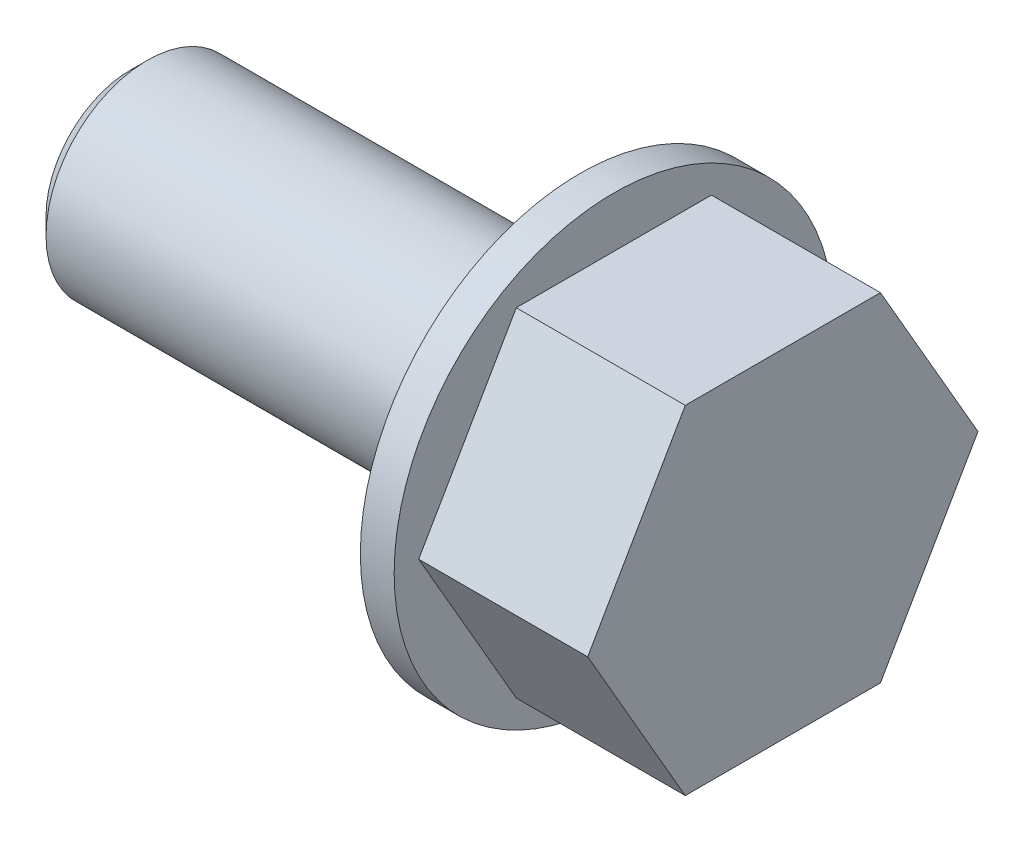
ISO-10303-21;
HEADER;
FILE_DESCRIPTION(('STEP AP214'),'2;1');
FILE_NAME('part.step','',(''),(''),'','','');
FILE_SCHEMA(('AUTOMOTIVE_DESIGN { 1 0 10303 214 1 1 1 1 }'));
ENDSEC;
DATA;
#1=APPLICATION_CONTEXT('core data for automotive mechanical design processes');
#2=APPLICATION_PROTOCOL_DEFINITION('international standard','automotive_design',2000,#1);
#3=PRODUCT_CONTEXT('',#1,'mechanical');
#4=PRODUCT('Part','Part','',(#3));
#5=PRODUCT_RELATED_PRODUCT_CATEGORY('part','',(#4));
#6=PRODUCT_DEFINITION_FORMATION('','',#4);
#7=PRODUCT_DEFINITION_CONTEXT('part definition',#1,'design');
#8=PRODUCT_DEFINITION('design','',#6,#7);
#9=PRODUCT_DEFINITION_SHAPE('','',#8);
#10=(LENGTH_UNIT() NAMED_UNIT(*) SI_UNIT(.MILLI.,.METRE.));
#11=(NAMED_UNIT(*) PLANE_ANGLE_UNIT() SI_UNIT($,.RADIAN.));
#12=(NAMED_UNIT(*) SI_UNIT($,.STERADIAN.) SOLID_ANGLE_UNIT());
#13=UNCERTAINTY_MEASURE_WITH_UNIT(LENGTH_MEASURE(1.E-05),#10,'distance_accuracy_value','');
#14=(GEOMETRIC_REPRESENTATION_CONTEXT(3) GLOBAL_UNCERTAINTY_ASSIGNED_CONTEXT((#13)) GLOBAL_UNIT_ASSIGNED_CONTEXT((#10,
#11,#12)) REPRESENTATION_CONTEXT('',''));
#15=CARTESIAN_POINT('',(0.,0.,0.));
#16=DIRECTION('',(0.,0.,1.));
#17=DIRECTION('',(1.,0.,0.));
#18=AXIS2_PLACEMENT_3D('',#15,#16,#17);
#19=CARTESIAN_POINT('',(168.319211312072,213.439611749176,57.3045490505835));
#20=DIRECTION('',(-1.,0.,0.));
#21=DIRECTION('',(0.,0.,1.));
#22=AXIS2_PLACEMENT_3D('',#19,#20,#21);
#23=PLANE('',#22);
#24=CARTESIAN_POINT('',(168.319211312072,213.439611749176,57.3045490505835));
#25=DIRECTION('',(-1.,0.,0.));
#26=DIRECTION('',(0.,0.,1.));
#27=AXIS2_PLACEMENT_3D('',#24,#25,#26);
#28=CIRCLE('',#27,2.5);
#29=CARTESIAN_POINT('',(168.319211312072,213.439611749176,59.8045490505835));
#30=VERTEX_POINT('',#29);
#31=EDGE_CURVE('E25',#30,#30,#28,.T.);
#32=ORIENTED_EDGE('',*,*,#31,.T.);
#33=EDGE_LOOP('',(#32));
#34=FACE_BOUND('',#33,.T.);
#35=ADVANCED_FACE('F17',(#34),#23,.T.);
#36=CARTESIAN_POINT('',(181.619211312073,213.439611749176,57.3045490505835));
#37=DIRECTION('',(-1.,0.,0.));
#38=DIRECTION('',(0.,0.,1.));
#39=AXIS2_PLACEMENT_3D('',#36,#37,#38);
#40=CYLINDRICAL_SURFACE('',#39,3.);
#41=CARTESIAN_POINT('',(168.819211312072,213.439611749176,57.3045490505835));
#42=DIRECTION('',(-1.,0.,0.));
#43=DIRECTION('',(0.,0.,1.));
#44=AXIS2_PLACEMENT_3D('',#41,#42,#43);
#45=CIRCLE('',#44,3.);
#46=CARTESIAN_POINT('',(168.819211312072,213.439611749176,60.3045490505835));
#47=VERTEX_POINT('',#46);
#48=EDGE_CURVE('E11',#47,#47,#45,.F.);
#49=ORIENTED_EDGE('',*,*,#48,.T.);
#50=EDGE_LOOP('',(#49));
#51=FACE_BOUND('',#50,.T.);
#52=CARTESIAN_POINT('',(181.619211312073,213.439611749176,57.3045490505835));
#53=DIRECTION('',(1.,0.,0.));
#54=DIRECTION('',(0.,0.,1.));
#55=AXIS2_PLACEMENT_3D('',#52,#53,#54);
#56=CIRCLE('',#55,3.);
#57=CARTESIAN_POINT('',(181.619211312073,213.439611749176,60.3045490505835));
#58=VERTEX_POINT('',#57);
#59=EDGE_CURVE('E95',#58,#58,#56,.T.);
#60=ORIENTED_EDGE('',*,*,#59,.F.);
#61=EDGE_LOOP('',(#60));
#62=FACE_BOUND('',#61,.T.);
#63=ADVANCED_FACE('F152',(#51,#62),#40,.T.);
#64=CARTESIAN_POINT('',(181.619211312073,218.439611749175,54.4177977046355));
#65=DIRECTION('',(-1.,0.,0.));
#66=DIRECTION('',(0.,0.,1.));
#67=AXIS2_PLACEMENT_3D('',#64,#65,#66);
#68=PLANE('',#67);
#69=ORIENTED_EDGE('',*,*,#59,.T.);
#70=EDGE_LOOP('',(#69));
#71=FACE_BOUND('',#70,.T.);
#72=CARTESIAN_POINT('',(181.619211312073,213.439611749175,57.3045490505835));
#73=DIRECTION('',(-1.,0.,0.));
#74=DIRECTION('',(0.,0.,1.));
#75=AXIS2_PLACEMENT_3D('',#72,#73,#74);
#76=CIRCLE('',#75,6.5);
#77=CARTESIAN_POINT('',(181.619211312073,213.439611749175,63.8045490505835));
#78=VERTEX_POINT('',#77);
#79=EDGE_CURVE('E131',#78,#78,#76,.T.);
#80=ORIENTED_EDGE('',*,*,#79,.T.);
#81=EDGE_LOOP('',(#80));
#82=FACE_BOUND('',#81,.T.);
#83=ADVANCED_FACE('F149',(#71,#82),#68,.T.);
#84=CARTESIAN_POINT('',(182.619211312073,213.439611749175,57.3045490505835));
#85=DIRECTION('',(-1.,0.,0.));
#86=DIRECTION('',(0.,0.,1.));
#87=AXIS2_PLACEMENT_3D('',#84,#85,#86);
#88=CYLINDRICAL_SURFACE('',#87,6.5);
#89=CARTESIAN_POINT('',(182.619211312073,213.439611749175,57.3045490505835));
#90=DIRECTION('',(-1.,0.,0.));
#91=DIRECTION('',(0.,0.,1.));
#92=AXIS2_PLACEMENT_3D('',#89,#90,#91);
#93=CIRCLE('',#92,6.5);
#94=CARTESIAN_POINT('',(182.619211312073,213.439611749175,63.8045490505835));
#95=VERTEX_POINT('',#94);
#96=EDGE_CURVE('E130',#95,#95,#93,.T.);
#97=ORIENTED_EDGE('',*,*,#96,.T.);
#98=EDGE_LOOP('',(#97));
#99=FACE_BOUND('',#98,.T.);
#100=ORIENTED_EDGE('',*,*,#79,.F.);
#101=EDGE_LOOP('',(#100));
#102=FACE_BOUND('',#101,.T.);
#103=ADVANCED_FACE('F137',(#99,#102),#88,.T.);
#104=CARTESIAN_POINT('',(182.619211312073,213.439611749175,57.3045490505835));
#105=DIRECTION('',(1.,0.,0.));
#106=DIRECTION('',(0.,0.,-1.));
#107=AXIS2_PLACEMENT_3D('',#104,#105,#106);
#108=PLANE('',#107);
#109=DIRECTION('',(0.,0.866025403784438,-0.5));
#110=VECTOR('',#109,1.);
#111=CARTESIAN_POINT('',(182.619211312073,208.439611749175,54.4177977046355));
#112=LINE('',#111,#110);
#113=CARTESIAN_POINT('',(182.619211312073,208.439611749175,54.4177977046355));
#114=VERTEX_POINT('',#113);
#115=CARTESIAN_POINT('',(182.619211312073,213.439611749175,51.5310463586873));
#116=VERTEX_POINT('',#115);
#117=EDGE_CURVE('E89',#114,#116,#112,.T.);
#118=ORIENTED_EDGE('',*,*,#117,.F.);
#119=DIRECTION('',(0.,0.,-1.));
#120=VECTOR('',#119,1.);
#121=CARTESIAN_POINT('',(182.619211312073,208.439611749175,60.1913003965317));
#122=LINE('',#121,#120);
#123=CARTESIAN_POINT('',(182.619211312073,208.439611749175,60.1913003965317));
#124=VERTEX_POINT('',#123);
#125=EDGE_CURVE('E128',#124,#114,#122,.T.);
#126=ORIENTED_EDGE('',*,*,#125,.F.);
#127=DIRECTION('',(0.,-0.866025403784439,-0.5));
#128=VECTOR('',#127,1.);
#129=CARTESIAN_POINT('',(182.619211312073,213.439611749175,63.0780517424798));
#130=LINE('',#129,#128);
#131=CARTESIAN_POINT('',(182.619211312073,213.439611749175,63.0780517424798));
#132=VERTEX_POINT('',#131);
#133=EDGE_CURVE('E125',#132,#124,#130,.T.);
#134=ORIENTED_EDGE('',*,*,#133,.F.);
#135=DIRECTION('',(0.,-0.866025403784437,0.5));
#136=VECTOR('',#135,1.);
#137=CARTESIAN_POINT('',(182.619211312073,218.439611749175,60.1913003965317));
#138=LINE('',#137,#136);
#139=CARTESIAN_POINT('',(182.619211312073,218.439611749175,60.1913003965317));
#140=VERTEX_POINT('',#139);
#141=EDGE_CURVE('E123',#140,#132,#138,.T.);
#142=ORIENTED_EDGE('',*,*,#141,.F.);
#143=DIRECTION('',(0.,0.,1.));
#144=VECTOR('',#143,1.);
#145=CARTESIAN_POINT('',(182.619211312073,218.439611749175,54.4177977046355));
#146=LINE('',#145,#144);
#147=CARTESIAN_POINT('',(182.619211312073,218.439611749175,54.4177977046355));
#148=VERTEX_POINT('',#147);
#149=EDGE_CURVE('E91',#148,#140,#146,.T.);
#150=ORIENTED_EDGE('',*,*,#149,.F.);
#151=DIRECTION('',(0.,0.86602540378444,0.5));
#152=VECTOR('',#151,1.);
#153=CARTESIAN_POINT('',(182.619211312073,213.439611749175,51.5310463586873));
#154=LINE('',#153,#152);
#155=EDGE_CURVE('E73',#116,#148,#154,.T.);
#156=ORIENTED_EDGE('',*,*,#155,.F.);
#157=EDGE_LOOP('',(#118,#126,#134,#142,#150,#156));
#158=FACE_BOUND('',#157,.T.);
#159=ORIENTED_EDGE('',*,*,#96,.F.);
#160=EDGE_LOOP('',(#159));
#161=FACE_BOUND('',#160,.T.);
#162=ADVANCED_FACE('F86',(#158,#161),#108,.T.);
#163=CARTESIAN_POINT('',(187.619211312073,218.439611749175,54.4177977046355));
#164=DIRECTION('',(-1.,0.,0.));
#165=DIRECTION('',(0.,0.,1.));
#166=AXIS2_PLACEMENT_3D('',#163,#164,#165);
#167=PLANE('',#166);
#168=DIRECTION('',(0.,0.86602540378444,0.5));
#169=VECTOR('',#168,1.);
#170=CARTESIAN_POINT('',(187.619211312073,213.439611749175,51.5310463586873));
#171=LINE('',#170,#169);
#172=CARTESIAN_POINT('',(187.619211312073,213.439611749175,51.5310463586873));
#173=VERTEX_POINT('',#172);
#174=CARTESIAN_POINT('',(187.619211312073,218.439611749175,54.4177977046355));
#175=VERTEX_POINT('',#174);
#176=EDGE_CURVE('E76',#173,#175,#171,.T.);
#177=ORIENTED_EDGE('',*,*,#176,.T.);
#178=DIRECTION('',(0.,0.,1.));
#179=VECTOR('',#178,1.);
#180=CARTESIAN_POINT('',(187.619211312073,218.439611749175,54.4177977046355));
#181=LINE('',#180,#179);
#182=CARTESIAN_POINT('',(187.619211312073,218.439611749175,60.1913003965317));
#183=VERTEX_POINT('',#182);
#184=EDGE_CURVE('E118',#175,#183,#181,.T.);
#185=ORIENTED_EDGE('',*,*,#184,.T.);
#186=DIRECTION('',(0.,-0.866025403784437,0.5));
#187=VECTOR('',#186,1.);
#188=CARTESIAN_POINT('',(187.619211312073,218.439611749175,60.1913003965317));
#189=LINE('',#188,#187);
#190=CARTESIAN_POINT('',(187.619211312073,213.439611749175,63.0780517424798));
#191=VERTEX_POINT('',#190);
#192=EDGE_CURVE('E115',#183,#191,#189,.T.);
#193=ORIENTED_EDGE('',*,*,#192,.T.);
#194=DIRECTION('',(0.,-0.866025403784439,-0.5));
#195=VECTOR('',#194,1.);
#196=CARTESIAN_POINT('',(187.619211312073,213.439611749175,63.0780517424798));
#197=LINE('',#196,#195);
#198=CARTESIAN_POINT('',(187.619211312073,208.439611749175,60.1913003965317));
#199=VERTEX_POINT('',#198);
#200=EDGE_CURVE('E112',#191,#199,#197,.T.);
#201=ORIENTED_EDGE('',*,*,#200,.T.);
#202=DIRECTION('',(0.,0.,-1.));
#203=VECTOR('',#202,1.);
#204=CARTESIAN_POINT('',(187.619211312073,208.439611749175,60.1913003965317));
#205=LINE('',#204,#203);
#206=CARTESIAN_POINT('',(187.619211312073,208.439611749175,54.4177977046355));
#207=VERTEX_POINT('',#206);
#208=EDGE_CURVE('E109',#199,#207,#205,.T.);
#209=ORIENTED_EDGE('',*,*,#208,.T.);
#210=DIRECTION('',(0.,0.866025403784438,-0.5));
#211=VECTOR('',#210,1.);
#212=CARTESIAN_POINT('',(187.619211312073,208.439611749175,54.4177977046355));
#213=LINE('',#212,#211);
#214=EDGE_CURVE('E82',#207,#173,#213,.T.);
#215=ORIENTED_EDGE('',*,*,#214,.T.);
#216=EDGE_LOOP('',(#177,#185,#193,#201,#209,#215));
#217=FACE_BOUND('',#216,.T.);
#218=ADVANCED_FACE('F140',(#217),#167,.F.);
#219=CARTESIAN_POINT('',(187.619211312073,208.439611749175,54.4177977046355));
#220=DIRECTION('',(0.,-0.5,-0.866025403784438));
#221=DIRECTION('',(0.,0.866025403784438,-0.5));
#222=AXIS2_PLACEMENT_3D('',#219,#220,#221);
#223=PLANE('',#222);
#224=ORIENTED_EDGE('',*,*,#117,.T.);
#225=DIRECTION('',(-1.,0.,0.));
#226=VECTOR('',#225,1.);
#227=CARTESIAN_POINT('',(187.619211312073,213.439611749175,51.5310463586873));
#228=LINE('',#227,#226);
#229=EDGE_CURVE('E70',#173,#116,#228,.T.);
#230=ORIENTED_EDGE('',*,*,#229,.F.);
#231=ORIENTED_EDGE('',*,*,#214,.F.);
#232=DIRECTION('',(-1.,0.,0.));
#233=VECTOR('',#232,1.);
#234=CARTESIAN_POINT('',(187.619211312073,208.439611749175,54.4177977046355));
#235=LINE('',#234,#233);
#236=EDGE_CURVE('E81',#207,#114,#235,.T.);
#237=ORIENTED_EDGE('',*,*,#236,.T.);
#238=EDGE_LOOP('',(#224,#230,#231,#237));
#239=FACE_BOUND('',#238,.T.);
#240=ADVANCED_FACE('F93',(#239),#223,.T.);
#241=CARTESIAN_POINT('',(187.619211312073,208.439611749175,60.1913003965317));
#242=DIRECTION('',(0.,-1.,0.));
#243=DIRECTION('',(0.,0.,-1.));
#244=AXIS2_PLACEMENT_3D('',#241,#242,#243);
#245=PLANE('',#244);
#246=ORIENTED_EDGE('',*,*,#125,.T.);
#247=ORIENTED_EDGE('',*,*,#236,.F.);
#248=ORIENTED_EDGE('',*,*,#208,.F.);
#249=DIRECTION('',(-1.,0.,0.));
#250=VECTOR('',#249,1.);
#251=CARTESIAN_POINT('',(187.619211312073,208.439611749175,60.1913003965317));
#252=LINE('',#251,#250);
#253=EDGE_CURVE('E105',#199,#124,#252,.T.);
#254=ORIENTED_EDGE('',*,*,#253,.T.);
#255=EDGE_LOOP('',(#246,#247,#248,#254));
#256=FACE_BOUND('',#255,.T.);
#257=ADVANCED_FACE('F171',(#256),#245,.T.);
#258=CARTESIAN_POINT('',(187.619211312073,213.439611749175,63.0780517424798));
#259=DIRECTION('',(0.,-0.5,0.866025403784439));
#260=DIRECTION('',(0.,-0.866025403784439,-0.5));
#261=AXIS2_PLACEMENT_3D('',#258,#259,#260);
#262=PLANE('',#261);
#263=ORIENTED_EDGE('',*,*,#133,.T.);
#264=ORIENTED_EDGE('',*,*,#253,.F.);
#265=ORIENTED_EDGE('',*,*,#200,.F.);
#266=DIRECTION('',(-1.,0.,0.));
#267=VECTOR('',#266,1.);
#268=CARTESIAN_POINT('',(187.619211312073,213.439611749175,63.0780517424798));
#269=LINE('',#268,#267);
#270=EDGE_CURVE('E103',#191,#132,#269,.T.);
#271=ORIENTED_EDGE('',*,*,#270,.T.);
#272=EDGE_LOOP('',(#263,#264,#265,#271));
#273=FACE_BOUND('',#272,.T.);
#274=ADVANCED_FACE('F168',(#273),#262,.T.);
#275=CARTESIAN_POINT('',(187.619211312073,218.439611749175,60.1913003965317));
#276=DIRECTION('',(0.,0.5,0.866025403784437));
#277=DIRECTION('',(0.,-0.866025403784437,0.5));
#278=AXIS2_PLACEMENT_3D('',#275,#276,#277);
#279=PLANE('',#278);
#280=ORIENTED_EDGE('',*,*,#141,.T.);
#281=ORIENTED_EDGE('',*,*,#270,.F.);
#282=ORIENTED_EDGE('',*,*,#192,.F.);
#283=DIRECTION('',(-1.,0.,0.));
#284=VECTOR('',#283,1.);
#285=CARTESIAN_POINT('',(187.619211312073,218.439611749175,60.1913003965317));
#286=LINE('',#285,#284);
#287=EDGE_CURVE('E40',#183,#140,#286,.T.);
#288=ORIENTED_EDGE('',*,*,#287,.T.);
#289=EDGE_LOOP('',(#280,#281,#282,#288));
#290=FACE_BOUND('',#289,.T.);
#291=ADVANCED_FACE('F165',(#290),#279,.T.);
#292=CARTESIAN_POINT('',(187.619211312073,218.439611749175,54.4177977046355));
#293=DIRECTION('',(0.,1.,0.));
#294=DIRECTION('',(0.,0.,1.));
#295=AXIS2_PLACEMENT_3D('',#292,#293,#294);
#296=PLANE('',#295);
#297=ORIENTED_EDGE('',*,*,#149,.T.);
#298=ORIENTED_EDGE('',*,*,#287,.F.);
#299=ORIENTED_EDGE('',*,*,#184,.F.);
#300=DIRECTION('',(-1.,0.,0.));
#301=VECTOR('',#300,1.);
#302=CARTESIAN_POINT('',(187.619211312073,218.439611749175,54.4177977046355));
#303=LINE('',#302,#301);
#304=EDGE_CURVE('E32',#175,#148,#303,.T.);
#305=ORIENTED_EDGE('',*,*,#304,.T.);
#306=EDGE_LOOP('',(#297,#298,#299,#305));
#307=FACE_BOUND('',#306,.T.);
#308=ADVANCED_FACE('F162',(#307),#296,.T.);
#309=CARTESIAN_POINT('',(187.619211312073,213.439611749175,51.5310463586873));
#310=DIRECTION('',(0.,0.5,-0.86602540378444));
#311=DIRECTION('',(0.,0.86602540378444,0.5));
#312=AXIS2_PLACEMENT_3D('',#309,#310,#311);
#313=PLANE('',#312);
#314=ORIENTED_EDGE('',*,*,#155,.T.);
#315=ORIENTED_EDGE('',*,*,#304,.F.);
#316=ORIENTED_EDGE('',*,*,#176,.F.);
#317=ORIENTED_EDGE('',*,*,#229,.T.);
#318=EDGE_LOOP('',(#314,#315,#316,#317));
#319=FACE_BOUND('',#318,.T.);
#320=ADVANCED_FACE('F72',(#319),#313,.T.);
#321=CARTESIAN_POINT('',(168.319211312072,213.439611749176,57.3045490505835));
#322=DIRECTION('',(1.,0.,0.));
#323=DIRECTION('',(0.,0.,-1.));
#324=AXIS2_PLACEMENT_3D('',#321,#322,#323);
#325=CONICAL_SURFACE('',#324,2.5,0.785398163397442);
#326=ORIENTED_EDGE('',*,*,#48,.F.);
#327=EDGE_LOOP('',(#326));
#328=FACE_BOUND('',#327,.T.);
#329=ORIENTED_EDGE('',*,*,#31,.F.);
#330=EDGE_LOOP('',(#329));
#331=FACE_BOUND('',#330,.T.);
#332=ADVANCED_FACE('F19',(#328,#331),#325,.T.);
#333=CLOSED_SHELL('',(#35,#63,#83,#103,#162,#218,#240,#257,#274,#291,#308,#320,#332));
#334=MANIFOLD_SOLID_BREP('B1',#333);
#335=ADVANCED_BREP_SHAPE_REPRESENTATION('',(#18,#334),#14);
#336=SHAPE_DEFINITION_REPRESENTATION(#9,#335);
ENDSEC;
END-ISO-10303-21;
